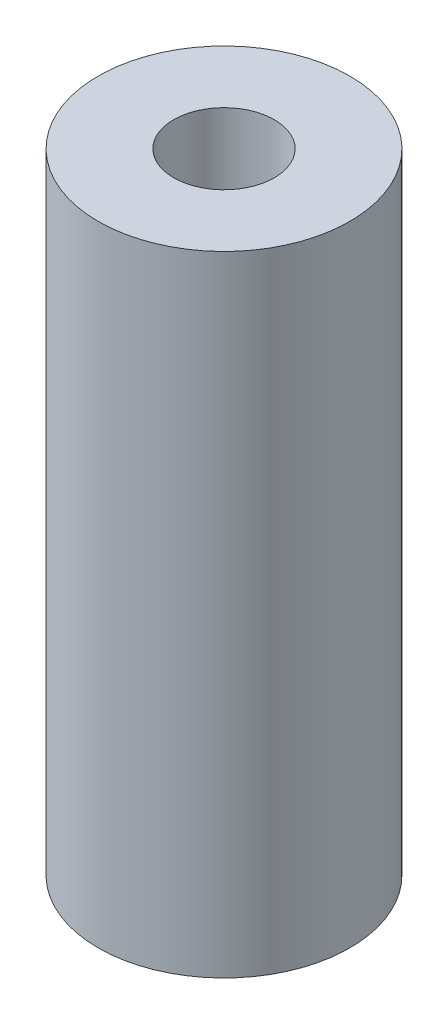
ISO-10303-21;
HEADER;
FILE_DESCRIPTION(('STEP AP214'),'2;1');
FILE_NAME('part.step','',(''),(''),'','','');
FILE_SCHEMA(('AUTOMOTIVE_DESIGN { 1 0 10303 214 1 1 1 1 }'));
ENDSEC;
DATA;
#1=APPLICATION_CONTEXT('core data for automotive mechanical design processes');
#2=APPLICATION_PROTOCOL_DEFINITION('international standard','automotive_design',2000,#1);
#3=PRODUCT_CONTEXT('',#1,'mechanical');
#4=PRODUCT('Part','Part','',(#3));
#5=PRODUCT_RELATED_PRODUCT_CATEGORY('part','',(#4));
#6=PRODUCT_DEFINITION_FORMATION('','',#4);
#7=PRODUCT_DEFINITION_CONTEXT('part definition',#1,'design');
#8=PRODUCT_DEFINITION('design','',#6,#7);
#9=PRODUCT_DEFINITION_SHAPE('','',#8);
#10=(LENGTH_UNIT() NAMED_UNIT(*) SI_UNIT(.MILLI.,.METRE.));
#11=(NAMED_UNIT(*) PLANE_ANGLE_UNIT() SI_UNIT($,.RADIAN.));
#12=(NAMED_UNIT(*) SI_UNIT($,.STERADIAN.) SOLID_ANGLE_UNIT());
#13=UNCERTAINTY_MEASURE_WITH_UNIT(LENGTH_MEASURE(1.E-05),#10,'distance_accuracy_value','');
#14=(GEOMETRIC_REPRESENTATION_CONTEXT(3) GLOBAL_UNCERTAINTY_ASSIGNED_CONTEXT((#13)) GLOBAL_UNIT_ASSIGNED_CONTEXT((#10,
#11,#12)) REPRESENTATION_CONTEXT('',''));
#15=CARTESIAN_POINT('',(0.,0.,0.));
#16=DIRECTION('',(0.,0.,1.));
#17=DIRECTION('',(1.,0.,0.));
#18=AXIS2_PLACEMENT_3D('',#15,#16,#17);
#19=CARTESIAN_POINT('',(0.,20.,0.));
#20=DIRECTION('',(0.,1.,0.));
#21=DIRECTION('',(0.,0.,1.));
#22=AXIS2_PLACEMENT_3D('',#19,#20,#21);
#23=PLANE('',#22);
#24=CARTESIAN_POINT('',(0.,20.,0.));
#25=DIRECTION('',(0.,1.,0.));
#26=DIRECTION('',(0.,0.,1.));
#27=AXIS2_PLACEMENT_3D('',#24,#25,#26);
#28=CIRCLE('',#27,4.);
#29=CARTESIAN_POINT('',(0.,20.,4.));
#30=VERTEX_POINT('',#29);
#31=EDGE_CURVE('E10',#30,#30,#28,.T.);
#32=ORIENTED_EDGE('',*,*,#31,.T.);
#33=EDGE_LOOP('',(#32));
#34=FACE_BOUND('',#33,.T.);
#35=CARTESIAN_POINT('',(0.,20.,0.));
#36=DIRECTION('',(0.,1.,0.));
#37=DIRECTION('',(0.,0.,1.));
#38=AXIS2_PLACEMENT_3D('',#35,#36,#37);
#39=CIRCLE('',#38,1.6);
#40=CARTESIAN_POINT('',(0.,20.,1.6));
#41=VERTEX_POINT('',#40);
#42=EDGE_CURVE('E50',#41,#41,#39,.T.);
#43=ORIENTED_EDGE('',*,*,#42,.F.);
#44=EDGE_LOOP('',(#43));
#45=FACE_BOUND('',#44,.T.);
#46=ADVANCED_FACE('F37',(#34,#45),#23,.T.);
#47=CARTESIAN_POINT('',(0.,0.,0.));
#48=DIRECTION('',(0.,1.,0.));
#49=DIRECTION('',(0.,0.,1.));
#50=AXIS2_PLACEMENT_3D('',#47,#48,#49);
#51=PLANE('',#50);
#52=CARTESIAN_POINT('',(0.,0.,0.));
#53=DIRECTION('',(0.,1.,0.));
#54=DIRECTION('',(0.,0.,1.));
#55=AXIS2_PLACEMENT_3D('',#52,#53,#54);
#56=CIRCLE('',#55,4.);
#57=CARTESIAN_POINT('',(0.,0.,4.));
#58=VERTEX_POINT('',#57);
#59=EDGE_CURVE('E41',#58,#58,#56,.T.);
#60=ORIENTED_EDGE('',*,*,#59,.F.);
#61=EDGE_LOOP('',(#60));
#62=FACE_BOUND('',#61,.T.);
#63=CARTESIAN_POINT('',(0.,0.,0.));
#64=DIRECTION('',(0.,1.,0.));
#65=DIRECTION('',(0.,0.,1.));
#66=AXIS2_PLACEMENT_3D('',#63,#64,#65);
#67=CIRCLE('',#66,1.6);
#68=CARTESIAN_POINT('',(0.,0.,1.6));
#69=VERTEX_POINT('',#68);
#70=EDGE_CURVE('E52',#69,#69,#67,.T.);
#71=ORIENTED_EDGE('',*,*,#70,.T.);
#72=EDGE_LOOP('',(#71));
#73=FACE_BOUND('',#72,.T.);
#74=ADVANCED_FACE('F64',(#62,#73),#51,.F.);
#75=CARTESIAN_POINT('',(0.,20.,0.));
#76=DIRECTION('',(0.,-1.,0.));
#77=DIRECTION('',(0.,0.,-1.));
#78=AXIS2_PLACEMENT_3D('',#75,#76,#77);
#79=CYLINDRICAL_SURFACE('',#78,4.);
#80=ORIENTED_EDGE('',*,*,#31,.F.);
#81=EDGE_LOOP('',(#80));
#82=FACE_BOUND('',#81,.T.);
#83=ORIENTED_EDGE('',*,*,#59,.T.);
#84=EDGE_LOOP('',(#83));
#85=FACE_BOUND('',#84,.T.);
#86=ADVANCED_FACE('F39',(#82,#85),#79,.T.);
#87=CARTESIAN_POINT('',(0.,20.,0.));
#88=DIRECTION('',(0.,-1.,0.));
#89=DIRECTION('',(0.,0.,-1.));
#90=AXIS2_PLACEMENT_3D('',#87,#88,#89);
#91=CYLINDRICAL_SURFACE('',#90,1.6);
#92=ORIENTED_EDGE('',*,*,#42,.T.);
#93=EDGE_LOOP('',(#92));
#94=FACE_BOUND('',#93,.T.);
#95=ORIENTED_EDGE('',*,*,#70,.F.);
#96=EDGE_LOOP('',(#95));
#97=FACE_BOUND('',#96,.T.);
#98=ADVANCED_FACE('F60',(#94,#97),#91,.F.);
#99=CLOSED_SHELL('',(#46,#74,#86,#98));
#100=MANIFOLD_SOLID_BREP('B2',#99);
#101=ADVANCED_BREP_SHAPE_REPRESENTATION('',(#18,#100),#14);
#102=SHAPE_DEFINITION_REPRESENTATION(#9,#101);
ENDSEC;
END-ISO-10303-21;
